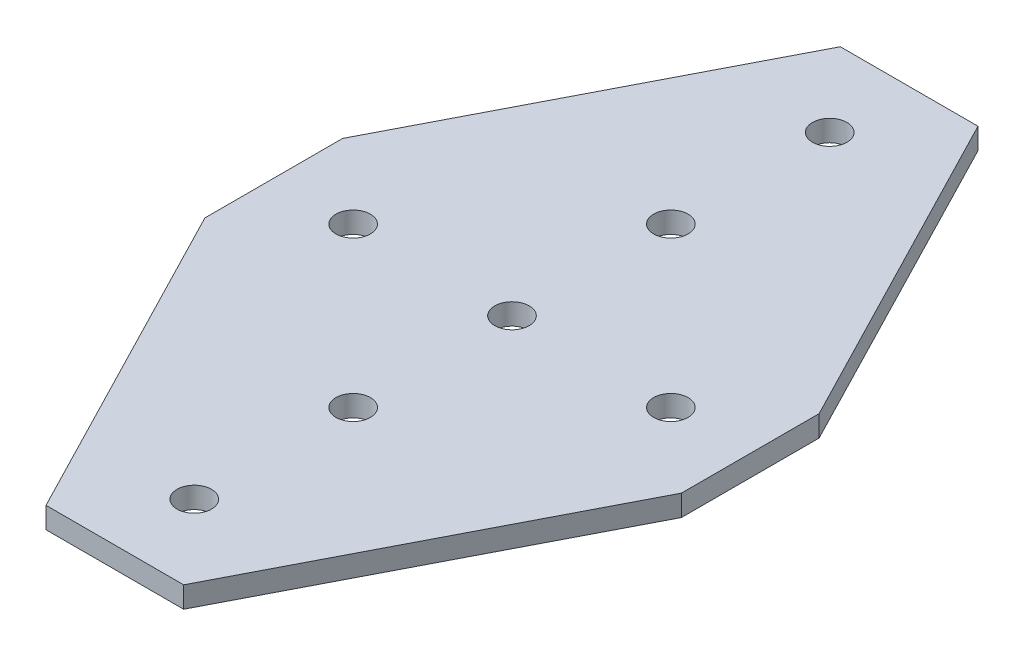
ISO-10303-21;
HEADER;
FILE_DESCRIPTION(('STEP AP214'),'2;1');
FILE_NAME('part.step','',(''),(''),'','','');
FILE_SCHEMA(('AUTOMOTIVE_DESIGN { 1 0 10303 214 1 1 1 1 }'));
ENDSEC;
DATA;
#1=APPLICATION_CONTEXT('core data for automotive mechanical design processes');
#2=APPLICATION_PROTOCOL_DEFINITION('international standard','automotive_design',2000,#1);
#3=PRODUCT_CONTEXT('',#1,'mechanical');
#4=PRODUCT('Part','Part','',(#3));
#5=PRODUCT_RELATED_PRODUCT_CATEGORY('part','',(#4));
#6=PRODUCT_DEFINITION_FORMATION('','',#4);
#7=PRODUCT_DEFINITION_CONTEXT('part definition',#1,'design');
#8=PRODUCT_DEFINITION('design','',#6,#7);
#9=PRODUCT_DEFINITION_SHAPE('','',#8);
#10=(LENGTH_UNIT() NAMED_UNIT(*) SI_UNIT(.MILLI.,.METRE.));
#11=(NAMED_UNIT(*) PLANE_ANGLE_UNIT() SI_UNIT($,.RADIAN.));
#12=(NAMED_UNIT(*) SI_UNIT($,.STERADIAN.) SOLID_ANGLE_UNIT());
#13=UNCERTAINTY_MEASURE_WITH_UNIT(LENGTH_MEASURE(1.E-05),#10,'distance_accuracy_value','');
#14=(GEOMETRIC_REPRESENTATION_CONTEXT(3) GLOBAL_UNCERTAINTY_ASSIGNED_CONTEXT((#13)) GLOBAL_UNIT_ASSIGNED_CONTEXT((#10,
#11,#12)) REPRESENTATION_CONTEXT('',''));
#15=CARTESIAN_POINT('',(0.,0.,0.));
#16=DIRECTION('',(0.,0.,1.));
#17=DIRECTION('',(1.,0.,0.));
#18=AXIS2_PLACEMENT_3D('',#15,#16,#17);
#19=CARTESIAN_POINT('',(13.,4.,0.));
#20=DIRECTION('',(-0.888620657054864,0.,-0.458642919770252));
#21=DIRECTION('',(-0.458642919770252,0.,0.888620657054864));
#22=AXIS2_PLACEMENT_3D('',#19,#20,#21);
#23=PLANE('',#22);
#24=DIRECTION('',(0.458642919770252,0.,-0.888620657054864));
#25=VECTOR('',#24,1.);
#26=CARTESIAN_POINT('',(13.,0.,0.));
#27=LINE('',#26,#25);
#28=CARTESIAN_POINT('',(13.,0.,0.));
#29=VERTEX_POINT('',#28);
#30=CARTESIAN_POINT('',(45.,0.,-62.));
#31=VERTEX_POINT('',#30);
#32=EDGE_CURVE('E137',#29,#31,#27,.T.);
#33=ORIENTED_EDGE('',*,*,#32,.T.);
#34=DIRECTION('',(0.,-1.,0.));
#35=VECTOR('',#34,1.);
#36=CARTESIAN_POINT('',(45.,4.,-62.));
#37=LINE('',#36,#35);
#38=CARTESIAN_POINT('',(45.,4.,-62.));
#39=VERTEX_POINT('',#38);
#40=EDGE_CURVE('E11',#39,#31,#37,.T.);
#41=ORIENTED_EDGE('',*,*,#40,.F.);
#42=DIRECTION('',(0.458642919770252,0.,-0.888620657054864));
#43=VECTOR('',#42,1.);
#44=CARTESIAN_POINT('',(13.,4.,0.));
#45=LINE('',#44,#43);
#46=CARTESIAN_POINT('',(13.,4.,0.));
#47=VERTEX_POINT('',#46);
#48=EDGE_CURVE('E152',#47,#39,#45,.T.);
#49=ORIENTED_EDGE('',*,*,#48,.F.);
#50=DIRECTION('',(0.,-1.,0.));
#51=VECTOR('',#50,1.);
#52=CARTESIAN_POINT('',(13.,4.,0.));
#53=LINE('',#52,#51);
#54=EDGE_CURVE('E133',#47,#29,#53,.T.);
#55=ORIENTED_EDGE('',*,*,#54,.T.);
#56=EDGE_LOOP('',(#33,#41,#49,#55));
#57=FACE_BOUND('',#56,.T.);
#58=ADVANCED_FACE('F41',(#57),#23,.F.);
#59=CARTESIAN_POINT('',(45.,4.,-62.));
#60=DIRECTION('',(-1.,0.,0.));
#61=DIRECTION('',(0.,0.,1.));
#62=AXIS2_PLACEMENT_3D('',#59,#60,#61);
#63=PLANE('',#62);
#64=DIRECTION('',(0.,0.,-1.));
#65=VECTOR('',#64,1.);
#66=CARTESIAN_POINT('',(45.,0.,-62.));
#67=LINE('',#66,#65);
#68=CARTESIAN_POINT('',(45.,0.,-88.));
#69=VERTEX_POINT('',#68);
#70=EDGE_CURVE('E140',#31,#69,#67,.T.);
#71=ORIENTED_EDGE('',*,*,#70,.T.);
#72=DIRECTION('',(0.,-1.,0.));
#73=VECTOR('',#72,1.);
#74=CARTESIAN_POINT('',(45.,4.,-88.));
#75=LINE('',#74,#73);
#76=CARTESIAN_POINT('',(45.,4.,-88.));
#77=VERTEX_POINT('',#76);
#78=EDGE_CURVE('E49',#77,#69,#75,.T.);
#79=ORIENTED_EDGE('',*,*,#78,.F.);
#80=DIRECTION('',(0.,0.,-1.));
#81=VECTOR('',#80,1.);
#82=CARTESIAN_POINT('',(45.,4.,-62.));
#83=LINE('',#82,#81);
#84=EDGE_CURVE('E100',#39,#77,#83,.T.);
#85=ORIENTED_EDGE('',*,*,#84,.F.);
#86=ORIENTED_EDGE('',*,*,#40,.T.);
#87=EDGE_LOOP('',(#71,#79,#85,#86));
#88=FACE_BOUND('',#87,.T.);
#89=ADVANCED_FACE('F252',(#88),#63,.F.);
#90=CARTESIAN_POINT('',(45.,4.,-88.));
#91=DIRECTION('',(-0.888620657054864,0.,0.458642919770252));
#92=DIRECTION('',(0.458642919770252,0.,0.888620657054864));
#93=AXIS2_PLACEMENT_3D('',#90,#91,#92);
#94=PLANE('',#93);
#95=DIRECTION('',(-0.458642919770252,0.,-0.888620657054864));
#96=VECTOR('',#95,1.);
#97=CARTESIAN_POINT('',(45.,0.,-88.));
#98=LINE('',#97,#96);
#99=CARTESIAN_POINT('',(13.,0.,-150.));
#100=VERTEX_POINT('',#99);
#101=EDGE_CURVE('E143',#69,#100,#98,.T.);
#102=ORIENTED_EDGE('',*,*,#101,.T.);
#103=DIRECTION('',(0.,-1.,0.));
#104=VECTOR('',#103,1.);
#105=CARTESIAN_POINT('',(13.,4.,-150.));
#106=LINE('',#105,#104);
#107=CARTESIAN_POINT('',(13.,4.,-150.));
#108=VERTEX_POINT('',#107);
#109=EDGE_CURVE('E159',#108,#100,#106,.T.);
#110=ORIENTED_EDGE('',*,*,#109,.F.);
#111=DIRECTION('',(-0.458642919770252,0.,-0.888620657054864));
#112=VECTOR('',#111,1.);
#113=CARTESIAN_POINT('',(45.,4.,-88.));
#114=LINE('',#113,#112);
#115=EDGE_CURVE('E167',#77,#108,#114,.T.);
#116=ORIENTED_EDGE('',*,*,#115,.F.);
#117=ORIENTED_EDGE('',*,*,#78,.T.);
#118=EDGE_LOOP('',(#102,#110,#116,#117));
#119=FACE_BOUND('',#118,.T.);
#120=ADVANCED_FACE('F165',(#119),#94,.F.);
#121=CARTESIAN_POINT('',(13.,4.,-150.));
#122=DIRECTION('',(0.,0.,1.));
#123=DIRECTION('',(1.,0.,0.));
#124=AXIS2_PLACEMENT_3D('',#121,#122,#123);
#125=PLANE('',#124);
#126=DIRECTION('',(-1.,0.,0.));
#127=VECTOR('',#126,1.);
#128=CARTESIAN_POINT('',(13.,0.,-150.));
#129=LINE('',#128,#127);
#130=CARTESIAN_POINT('',(-13.,0.,-150.));
#131=VERTEX_POINT('',#130);
#132=EDGE_CURVE('E145',#100,#131,#129,.T.);
#133=ORIENTED_EDGE('',*,*,#132,.T.);
#134=DIRECTION('',(0.,-1.,0.));
#135=VECTOR('',#134,1.);
#136=CARTESIAN_POINT('',(-13.,4.,-150.));
#137=LINE('',#136,#135);
#138=CARTESIAN_POINT('',(-13.,4.,-150.));
#139=VERTEX_POINT('',#138);
#140=EDGE_CURVE('E156',#139,#131,#137,.T.);
#141=ORIENTED_EDGE('',*,*,#140,.F.);
#142=DIRECTION('',(-1.,0.,0.));
#143=VECTOR('',#142,1.);
#144=CARTESIAN_POINT('',(13.,4.,-150.));
#145=LINE('',#144,#143);
#146=EDGE_CURVE('E179',#108,#139,#145,.T.);
#147=ORIENTED_EDGE('',*,*,#146,.F.);
#148=ORIENTED_EDGE('',*,*,#109,.T.);
#149=EDGE_LOOP('',(#133,#141,#147,#148));
#150=FACE_BOUND('',#149,.T.);
#151=ADVANCED_FACE('F175',(#150),#125,.F.);
#152=CARTESIAN_POINT('',(-45.,4.,-88.));
#153=DIRECTION('',(0.888620657054864,0.,0.458642919770252));
#154=DIRECTION('',(0.458642919770252,0.,-0.888620657054864));
#155=AXIS2_PLACEMENT_3D('',#152,#153,#154);
#156=PLANE('',#155);
#157=DIRECTION('',(-0.458642919770252,0.,0.888620657054864));
#158=VECTOR('',#157,1.);
#159=CARTESIAN_POINT('',(-45.,0.,-88.));
#160=LINE('',#159,#158);
#161=CARTESIAN_POINT('',(-45.,0.,-88.));
#162=VERTEX_POINT('',#161);
#163=EDGE_CURVE('E147',#131,#162,#160,.T.);
#164=ORIENTED_EDGE('',*,*,#163,.T.);
#165=DIRECTION('',(0.,-1.,0.));
#166=VECTOR('',#165,1.);
#167=CARTESIAN_POINT('',(-45.,4.,-88.));
#168=LINE('',#167,#166);
#169=CARTESIAN_POINT('',(-45.,4.,-88.));
#170=VERTEX_POINT('',#169);
#171=EDGE_CURVE('E128',#170,#162,#168,.T.);
#172=ORIENTED_EDGE('',*,*,#171,.F.);
#173=DIRECTION('',(-0.458642919770252,0.,0.888620657054864));
#174=VECTOR('',#173,1.);
#175=CARTESIAN_POINT('',(-45.,4.,-88.));
#176=LINE('',#175,#174);
#177=EDGE_CURVE('E119',#139,#170,#176,.T.);
#178=ORIENTED_EDGE('',*,*,#177,.F.);
#179=ORIENTED_EDGE('',*,*,#140,.T.);
#180=EDGE_LOOP('',(#164,#172,#178,#179));
#181=FACE_BOUND('',#180,.T.);
#182=ADVANCED_FACE('F178',(#181),#156,.F.);
#183=CARTESIAN_POINT('',(-45.,4.,-62.));
#184=DIRECTION('',(1.,0.,0.));
#185=DIRECTION('',(0.,0.,-1.));
#186=AXIS2_PLACEMENT_3D('',#183,#184,#185);
#187=PLANE('',#186);
#188=DIRECTION('',(0.,0.,1.));
#189=VECTOR('',#188,1.);
#190=CARTESIAN_POINT('',(-45.,0.,-62.));
#191=LINE('',#190,#189);
#192=CARTESIAN_POINT('',(-45.,0.,-62.));
#193=VERTEX_POINT('',#192);
#194=EDGE_CURVE('E127',#162,#193,#191,.T.);
#195=ORIENTED_EDGE('',*,*,#194,.T.);
#196=DIRECTION('',(0.,-1.,0.));
#197=VECTOR('',#196,1.);
#198=CARTESIAN_POINT('',(-45.,4.,-62.));
#199=LINE('',#198,#197);
#200=CARTESIAN_POINT('',(-45.,4.,-62.));
#201=VERTEX_POINT('',#200);
#202=EDGE_CURVE('E124',#201,#193,#199,.T.);
#203=ORIENTED_EDGE('',*,*,#202,.F.);
#204=DIRECTION('',(0.,0.,1.));
#205=VECTOR('',#204,1.);
#206=CARTESIAN_POINT('',(-45.,4.,-62.));
#207=LINE('',#206,#205);
#208=EDGE_CURVE('E113',#170,#201,#207,.T.);
#209=ORIENTED_EDGE('',*,*,#208,.F.);
#210=ORIENTED_EDGE('',*,*,#171,.T.);
#211=EDGE_LOOP('',(#195,#203,#209,#210));
#212=FACE_BOUND('',#211,.T.);
#213=ADVANCED_FACE('F125',(#212),#187,.F.);
#214=CARTESIAN_POINT('',(-13.,4.,0.));
#215=DIRECTION('',(0.888620657054864,0.,-0.458642919770252));
#216=DIRECTION('',(-0.458642919770252,0.,-0.888620657054864));
#217=AXIS2_PLACEMENT_3D('',#214,#215,#216);
#218=PLANE('',#217);
#219=DIRECTION('',(0.458642919770252,0.,0.888620657054864));
#220=VECTOR('',#219,1.);
#221=CARTESIAN_POINT('',(-13.,0.,0.));
#222=LINE('',#221,#220);
#223=CARTESIAN_POINT('',(-13.,0.,0.));
#224=VERTEX_POINT('',#223);
#225=EDGE_CURVE('E86',#193,#224,#222,.T.);
#226=ORIENTED_EDGE('',*,*,#225,.T.);
#227=DIRECTION('',(0.,-1.,0.));
#228=VECTOR('',#227,1.);
#229=CARTESIAN_POINT('',(-13.,4.,0.));
#230=LINE('',#229,#228);
#231=CARTESIAN_POINT('',(-13.,4.,0.));
#232=VERTEX_POINT('',#231);
#233=EDGE_CURVE('E129',#232,#224,#230,.T.);
#234=ORIENTED_EDGE('',*,*,#233,.F.);
#235=DIRECTION('',(0.458642919770252,0.,0.888620657054864));
#236=VECTOR('',#235,1.);
#237=CARTESIAN_POINT('',(-13.,4.,0.));
#238=LINE('',#237,#236);
#239=EDGE_CURVE('E117',#201,#232,#238,.T.);
#240=ORIENTED_EDGE('',*,*,#239,.F.);
#241=ORIENTED_EDGE('',*,*,#202,.T.);
#242=EDGE_LOOP('',(#226,#234,#240,#241));
#243=FACE_BOUND('',#242,.T.);
#244=ADVANCED_FACE('F131',(#243),#218,.F.);
#245=CARTESIAN_POINT('',(-13.,4.,0.));
#246=DIRECTION('',(0.,0.,-1.));
#247=DIRECTION('',(-1.,0.,0.));
#248=AXIS2_PLACEMENT_3D('',#245,#246,#247);
#249=PLANE('',#248);
#250=DIRECTION('',(1.,0.,0.));
#251=VECTOR('',#250,1.);
#252=CARTESIAN_POINT('',(-13.,0.,0.));
#253=LINE('',#252,#251);
#254=EDGE_CURVE('E92',#224,#29,#253,.T.);
#255=ORIENTED_EDGE('',*,*,#254,.T.);
#256=ORIENTED_EDGE('',*,*,#54,.F.);
#257=DIRECTION('',(1.,0.,0.));
#258=VECTOR('',#257,1.);
#259=CARTESIAN_POINT('',(-13.,4.,0.));
#260=LINE('',#259,#258);
#261=EDGE_CURVE('E57',#232,#47,#260,.T.);
#262=ORIENTED_EDGE('',*,*,#261,.F.);
#263=ORIENTED_EDGE('',*,*,#233,.T.);
#264=EDGE_LOOP('',(#255,#256,#262,#263));
#265=FACE_BOUND('',#264,.T.);
#266=ADVANCED_FACE('F231',(#265),#249,.F.);
#267=CARTESIAN_POINT('',(0.,4.,0.));
#268=DIRECTION('',(0.,1.,0.));
#269=DIRECTION('',(0.,0.,1.));
#270=AXIS2_PLACEMENT_3D('',#267,#268,#269);
#271=PLANE('',#270);
#272=CARTESIAN_POINT('',(5.83159337170879E-13,4.,-15.));
#273=DIRECTION('',(0.,1.,0.));
#274=DIRECTION('',(0.,0.,1.));
#275=AXIS2_PLACEMENT_3D('',#272,#273,#274);
#276=CIRCLE('',#275,3.24999999999984);
#277=CARTESIAN_POINT('',(5.83159337170879E-13,4.,-11.7500000000002));
#278=VERTEX_POINT('',#277);
#279=EDGE_CURVE('E194',#278,#278,#276,.T.);
#280=ORIENTED_EDGE('',*,*,#279,.F.);
#281=EDGE_LOOP('',(#280));
#282=FACE_BOUND('',#281,.T.);
#283=CARTESIAN_POINT('',(2.70762986873718E-13,4.,-45.));
#284=DIRECTION('',(0.,1.,0.));
#285=DIRECTION('',(0.,0.,1.));
#286=AXIS2_PLACEMENT_3D('',#283,#284,#285);
#287=CIRCLE('',#286,3.24999999999984);
#288=CARTESIAN_POINT('',(2.70762986873718E-13,4.,-41.7500000000002));
#289=VERTEX_POINT('',#288);
#290=EDGE_CURVE('E200',#289,#289,#287,.T.);
#291=ORIENTED_EDGE('',*,*,#290,.F.);
#292=EDGE_LOOP('',(#291));
#293=FACE_BOUND('',#292,.T.);
#294=CARTESIAN_POINT('',(-2.47448303356589E-13,4.,-135.));
#295=DIRECTION('',(0.,1.,0.));
#296=DIRECTION('',(0.,0.,1.));
#297=AXIS2_PLACEMENT_3D('',#294,#295,#296);
#298=CIRCLE('',#297,3.24999999999983);
#299=CARTESIAN_POINT('',(-2.47448303356589E-13,4.,-131.75));
#300=VERTEX_POINT('',#299);
#301=EDGE_CURVE('E206',#300,#300,#298,.T.);
#302=ORIENTED_EDGE('',*,*,#301,.F.);
#303=EDGE_LOOP('',(#302));
#304=FACE_BOUND('',#303,.T.);
#305=CARTESIAN_POINT('',(-1.44540833390016E-13,4.,-105.));
#306=DIRECTION('',(0.,1.,0.));
#307=DIRECTION('',(0.,0.,1.));
#308=AXIS2_PLACEMENT_3D('',#305,#306,#307);
#309=CIRCLE('',#308,3.24999999999983);
#310=CARTESIAN_POINT('',(-1.44540833390016E-13,4.,-101.75));
#311=VERTEX_POINT('',#310);
#312=EDGE_CURVE('E212',#311,#311,#309,.T.);
#313=ORIENTED_EDGE('',*,*,#312,.F.);
#314=EDGE_LOOP('',(#313));
#315=FACE_BOUND('',#314,.T.);
#316=CARTESIAN_POINT('',(-30.,4.,-74.9999999999998));
#317=DIRECTION('',(0.,1.,0.));
#318=DIRECTION('',(0.,0.,1.));
#319=AXIS2_PLACEMENT_3D('',#316,#317,#318);
#320=CIRCLE('',#319,3.24999999999984);
#321=CARTESIAN_POINT('',(-30.,4.,-71.75));
#322=VERTEX_POINT('',#321);
#323=EDGE_CURVE('E218',#322,#322,#320,.T.);
#324=ORIENTED_EDGE('',*,*,#323,.F.);
#325=EDGE_LOOP('',(#324));
#326=FACE_BOUND('',#325,.T.);
#327=CARTESIAN_POINT('',(30.,4.,-75.));
#328=DIRECTION('',(0.,1.,0.));
#329=DIRECTION('',(0.,0.,1.));
#330=AXIS2_PLACEMENT_3D('',#327,#328,#329);
#331=CIRCLE('',#330,3.24999999999983);
#332=CARTESIAN_POINT('',(30.,4.,-71.7500000000002));
#333=VERTEX_POINT('',#332);
#334=EDGE_CURVE('E188',#333,#333,#331,.T.);
#335=ORIENTED_EDGE('',*,*,#334,.F.);
#336=EDGE_LOOP('',(#335));
#337=FACE_BOUND('',#336,.T.);
#338=CARTESIAN_POINT('',(0.,4.,-75.));
#339=DIRECTION('',(0.,1.,0.));
#340=DIRECTION('',(0.,0.,1.));
#341=AXIS2_PLACEMENT_3D('',#338,#339,#340);
#342=CIRCLE('',#341,3.24999999999983);
#343=CARTESIAN_POINT('',(0.,4.,-71.7500000000002));
#344=VERTEX_POINT('',#343);
#345=EDGE_CURVE('E185',#344,#344,#342,.T.);
#346=ORIENTED_EDGE('',*,*,#345,.F.);
#347=EDGE_LOOP('',(#346));
#348=FACE_BOUND('',#347,.T.);
#349=ORIENTED_EDGE('',*,*,#48,.T.);
#350=ORIENTED_EDGE('',*,*,#84,.T.);
#351=ORIENTED_EDGE('',*,*,#115,.T.);
#352=ORIENTED_EDGE('',*,*,#146,.T.);
#353=ORIENTED_EDGE('',*,*,#177,.T.);
#354=ORIENTED_EDGE('',*,*,#208,.T.);
#355=ORIENTED_EDGE('',*,*,#239,.T.);
#356=ORIENTED_EDGE('',*,*,#261,.T.);
#357=EDGE_LOOP('',(#349,#350,#351,#352,#353,#354,#355,#356));
#358=FACE_BOUND('',#357,.T.);
#359=ADVANCED_FACE('F115',(#282,#293,#304,#315,#326,#337,#348,#358),#271,.T.);
#360=CARTESIAN_POINT('',(0.,0.,0.));
#361=DIRECTION('',(0.,1.,0.));
#362=DIRECTION('',(0.,0.,1.));
#363=AXIS2_PLACEMENT_3D('',#360,#361,#362);
#364=PLANE('',#363);
#365=CARTESIAN_POINT('',(5.83159337170879E-13,0.,-15.));
#366=DIRECTION('',(0.,1.,0.));
#367=DIRECTION('',(0.,0.,1.));
#368=AXIS2_PLACEMENT_3D('',#365,#366,#367);
#369=CIRCLE('',#368,3.24999999999984);
#370=CARTESIAN_POINT('',(5.83159337170879E-13,0.,-11.7500000000002));
#371=VERTEX_POINT('',#370);
#372=EDGE_CURVE('E191',#371,#371,#369,.T.);
#373=ORIENTED_EDGE('',*,*,#372,.T.);
#374=EDGE_LOOP('',(#373));
#375=FACE_BOUND('',#374,.T.);
#376=CARTESIAN_POINT('',(2.70762986873718E-13,0.,-45.));
#377=DIRECTION('',(0.,1.,0.));
#378=DIRECTION('',(0.,0.,1.));
#379=AXIS2_PLACEMENT_3D('',#376,#377,#378);
#380=CIRCLE('',#379,3.24999999999984);
#381=CARTESIAN_POINT('',(2.70762986873718E-13,0.,-41.7500000000002));
#382=VERTEX_POINT('',#381);
#383=EDGE_CURVE('E197',#382,#382,#380,.T.);
#384=ORIENTED_EDGE('',*,*,#383,.T.);
#385=EDGE_LOOP('',(#384));
#386=FACE_BOUND('',#385,.T.);
#387=CARTESIAN_POINT('',(-2.47448303356589E-13,0.,-135.));
#388=DIRECTION('',(0.,1.,0.));
#389=DIRECTION('',(0.,0.,1.));
#390=AXIS2_PLACEMENT_3D('',#387,#388,#389);
#391=CIRCLE('',#390,3.24999999999983);
#392=CARTESIAN_POINT('',(-2.47448303356589E-13,0.,-131.75));
#393=VERTEX_POINT('',#392);
#394=EDGE_CURVE('E203',#393,#393,#391,.T.);
#395=ORIENTED_EDGE('',*,*,#394,.T.);
#396=EDGE_LOOP('',(#395));
#397=FACE_BOUND('',#396,.T.);
#398=CARTESIAN_POINT('',(-1.44540833390016E-13,0.,-105.));
#399=DIRECTION('',(0.,1.,0.));
#400=DIRECTION('',(0.,0.,1.));
#401=AXIS2_PLACEMENT_3D('',#398,#399,#400);
#402=CIRCLE('',#401,3.24999999999983);
#403=CARTESIAN_POINT('',(-1.44540833390016E-13,0.,-101.75));
#404=VERTEX_POINT('',#403);
#405=EDGE_CURVE('E209',#404,#404,#402,.T.);
#406=ORIENTED_EDGE('',*,*,#405,.T.);
#407=EDGE_LOOP('',(#406));
#408=FACE_BOUND('',#407,.T.);
#409=CARTESIAN_POINT('',(-30.,0.,-74.9999999999998));
#410=DIRECTION('',(0.,1.,0.));
#411=DIRECTION('',(0.,0.,1.));
#412=AXIS2_PLACEMENT_3D('',#409,#410,#411);
#413=CIRCLE('',#412,3.24999999999984);
#414=CARTESIAN_POINT('',(-30.,0.,-71.75));
#415=VERTEX_POINT('',#414);
#416=EDGE_CURVE('E215',#415,#415,#413,.T.);
#417=ORIENTED_EDGE('',*,*,#416,.T.);
#418=EDGE_LOOP('',(#417));
#419=FACE_BOUND('',#418,.T.);
#420=CARTESIAN_POINT('',(30.,0.,-75.));
#421=DIRECTION('',(0.,1.,0.));
#422=DIRECTION('',(0.,0.,1.));
#423=AXIS2_PLACEMENT_3D('',#420,#421,#422);
#424=CIRCLE('',#423,3.24999999999983);
#425=CARTESIAN_POINT('',(30.,0.,-71.7500000000002));
#426=VERTEX_POINT('',#425);
#427=EDGE_CURVE('E221',#426,#426,#424,.T.);
#428=ORIENTED_EDGE('',*,*,#427,.T.);
#429=EDGE_LOOP('',(#428));
#430=FACE_BOUND('',#429,.T.);
#431=CARTESIAN_POINT('',(0.,0.,-75.));
#432=DIRECTION('',(0.,1.,0.));
#433=DIRECTION('',(0.,0.,1.));
#434=AXIS2_PLACEMENT_3D('',#431,#432,#433);
#435=CIRCLE('',#434,3.24999999999983);
#436=CARTESIAN_POINT('',(0.,0.,-71.7500000000002));
#437=VERTEX_POINT('',#436);
#438=EDGE_CURVE('E141',#437,#437,#435,.T.);
#439=ORIENTED_EDGE('',*,*,#438,.T.);
#440=EDGE_LOOP('',(#439));
#441=FACE_BOUND('',#440,.T.);
#442=ORIENTED_EDGE('',*,*,#32,.F.);
#443=ORIENTED_EDGE('',*,*,#254,.F.);
#444=ORIENTED_EDGE('',*,*,#225,.F.);
#445=ORIENTED_EDGE('',*,*,#194,.F.);
#446=ORIENTED_EDGE('',*,*,#163,.F.);
#447=ORIENTED_EDGE('',*,*,#132,.F.);
#448=ORIENTED_EDGE('',*,*,#101,.F.);
#449=ORIENTED_EDGE('',*,*,#70,.F.);
#450=EDGE_LOOP('',(#442,#443,#444,#445,#446,#447,#448,#449));
#451=FACE_BOUND('',#450,.T.);
#452=ADVANCED_FACE('F171',(#375,#386,#397,#408,#419,#430,#441,#451),#364,.F.);
#453=CARTESIAN_POINT('',(0.,0.,-75.));
#454=DIRECTION('',(0.,1.,0.));
#455=DIRECTION('',(0.,0.,1.));
#456=AXIS2_PLACEMENT_3D('',#453,#454,#455);
#457=CYLINDRICAL_SURFACE('',#456,3.24999999999983);
#458=ORIENTED_EDGE('',*,*,#438,.F.);
#459=EDGE_LOOP('',(#458));
#460=FACE_BOUND('',#459,.T.);
#461=ORIENTED_EDGE('',*,*,#345,.T.);
#462=EDGE_LOOP('',(#461));
#463=FACE_BOUND('',#462,.T.);
#464=ADVANCED_FACE('F236',(#460,#463),#457,.F.);
#465=CARTESIAN_POINT('',(30.,0.,-75.));
#466=DIRECTION('',(0.,1.,0.));
#467=DIRECTION('',(0.,0.,1.));
#468=AXIS2_PLACEMENT_3D('',#465,#466,#467);
#469=CYLINDRICAL_SURFACE('',#468,3.24999999999983);
#470=ORIENTED_EDGE('',*,*,#427,.F.);
#471=EDGE_LOOP('',(#470));
#472=FACE_BOUND('',#471,.T.);
#473=ORIENTED_EDGE('',*,*,#334,.T.);
#474=EDGE_LOOP('',(#473));
#475=FACE_BOUND('',#474,.T.);
#476=ADVANCED_FACE('F227',(#472,#475),#469,.F.);
#477=CARTESIAN_POINT('',(-30.,0.,-74.9999999999998));
#478=DIRECTION('',(0.,1.,0.));
#479=DIRECTION('',(0.,0.,1.));
#480=AXIS2_PLACEMENT_3D('',#477,#478,#479);
#481=CYLINDRICAL_SURFACE('',#480,3.24999999999984);
#482=ORIENTED_EDGE('',*,*,#416,.F.);
#483=EDGE_LOOP('',(#482));
#484=FACE_BOUND('',#483,.T.);
#485=ORIENTED_EDGE('',*,*,#323,.T.);
#486=EDGE_LOOP('',(#485));
#487=FACE_BOUND('',#486,.T.);
#488=ADVANCED_FACE('F244',(#484,#487),#481,.F.);
#489=CARTESIAN_POINT('',(-1.44540833390016E-13,0.,-105.));
#490=DIRECTION('',(0.,1.,0.));
#491=DIRECTION('',(0.,0.,1.));
#492=AXIS2_PLACEMENT_3D('',#489,#490,#491);
#493=CYLINDRICAL_SURFACE('',#492,3.24999999999983);
#494=ORIENTED_EDGE('',*,*,#405,.F.);
#495=EDGE_LOOP('',(#494));
#496=FACE_BOUND('',#495,.T.);
#497=ORIENTED_EDGE('',*,*,#312,.T.);
#498=EDGE_LOOP('',(#497));
#499=FACE_BOUND('',#498,.T.);
#500=ADVANCED_FACE('F333',(#496,#499),#493,.F.);
#501=CARTESIAN_POINT('',(-2.47448303356589E-13,0.,-135.));
#502=DIRECTION('',(0.,1.,0.));
#503=DIRECTION('',(0.,0.,1.));
#504=AXIS2_PLACEMENT_3D('',#501,#502,#503);
#505=CYLINDRICAL_SURFACE('',#504,3.24999999999983);
#506=ORIENTED_EDGE('',*,*,#394,.F.);
#507=EDGE_LOOP('',(#506));
#508=FACE_BOUND('',#507,.T.);
#509=ORIENTED_EDGE('',*,*,#301,.T.);
#510=EDGE_LOOP('',(#509));
#511=FACE_BOUND('',#510,.T.);
#512=ADVANCED_FACE('F343',(#508,#511),#505,.F.);
#513=CARTESIAN_POINT('',(2.70762986873718E-13,0.,-45.));
#514=DIRECTION('',(0.,1.,0.));
#515=DIRECTION('',(0.,0.,1.));
#516=AXIS2_PLACEMENT_3D('',#513,#514,#515);
#517=CYLINDRICAL_SURFACE('',#516,3.24999999999984);
#518=ORIENTED_EDGE('',*,*,#383,.F.);
#519=EDGE_LOOP('',(#518));
#520=FACE_BOUND('',#519,.T.);
#521=ORIENTED_EDGE('',*,*,#290,.T.);
#522=EDGE_LOOP('',(#521));
#523=FACE_BOUND('',#522,.T.);
#524=ADVANCED_FACE('F353',(#520,#523),#517,.F.);
#525=CARTESIAN_POINT('',(5.83159337170879E-13,0.,-15.));
#526=DIRECTION('',(0.,1.,0.));
#527=DIRECTION('',(0.,0.,1.));
#528=AXIS2_PLACEMENT_3D('',#525,#526,#527);
#529=CYLINDRICAL_SURFACE('',#528,3.24999999999984);
#530=ORIENTED_EDGE('',*,*,#372,.F.);
#531=EDGE_LOOP('',(#530));
#532=FACE_BOUND('',#531,.T.);
#533=ORIENTED_EDGE('',*,*,#279,.T.);
#534=EDGE_LOOP('',(#533));
#535=FACE_BOUND('',#534,.T.);
#536=ADVANCED_FACE('F363',(#532,#535),#529,.F.);
#537=CLOSED_SHELL('',(#58,#89,#120,#151,#182,#213,#244,#266,#359,#452,#464,#476,#488,#500,#512,
#524,#536));
#538=MANIFOLD_SOLID_BREP('B2',#537);
#539=ADVANCED_BREP_SHAPE_REPRESENTATION('',(#18,#538),#14);
#540=SHAPE_DEFINITION_REPRESENTATION(#9,#539);
ENDSEC;
END-ISO-10303-21;
